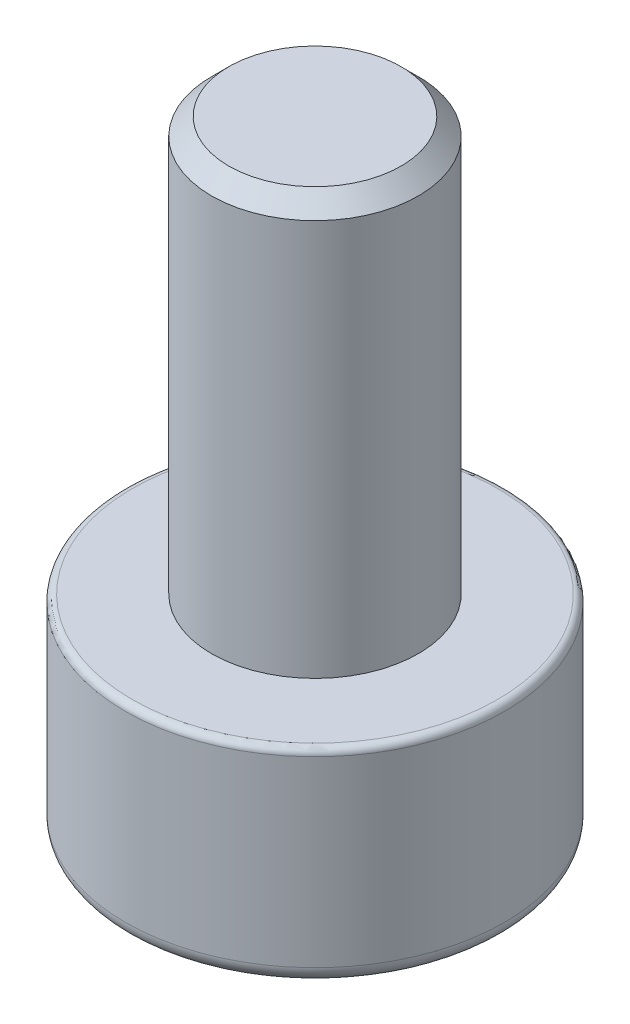
ISO-10303-21;
HEADER;
FILE_DESCRIPTION(('STEP AP214'),'2;1');
FILE_NAME('part.step','',(''),(''),'','','');
FILE_SCHEMA(('AUTOMOTIVE_DESIGN { 1 0 10303 214 1 1 1 1 }'));
ENDSEC;
DATA;
#1=APPLICATION_CONTEXT('core data for automotive mechanical design processes');
#2=APPLICATION_PROTOCOL_DEFINITION('international standard','automotive_design',2000,#1);
#3=PRODUCT_CONTEXT('',#1,'mechanical');
#4=PRODUCT('Part','Part','',(#3));
#5=PRODUCT_RELATED_PRODUCT_CATEGORY('part','',(#4));
#6=PRODUCT_DEFINITION_FORMATION('','',#4);
#7=PRODUCT_DEFINITION_CONTEXT('part definition',#1,'design');
#8=PRODUCT_DEFINITION('design','',#6,#7);
#9=PRODUCT_DEFINITION_SHAPE('','',#8);
#10=(LENGTH_UNIT() NAMED_UNIT(*) SI_UNIT(.MILLI.,.METRE.));
#11=(NAMED_UNIT(*) PLANE_ANGLE_UNIT() SI_UNIT($,.RADIAN.));
#12=(NAMED_UNIT(*) SI_UNIT($,.STERADIAN.) SOLID_ANGLE_UNIT());
#13=UNCERTAINTY_MEASURE_WITH_UNIT(LENGTH_MEASURE(1.E-05),#10,'distance_accuracy_value','');
#14=(GEOMETRIC_REPRESENTATION_CONTEXT(3) GLOBAL_UNCERTAINTY_ASSIGNED_CONTEXT((#13)) GLOBAL_UNIT_ASSIGNED_CONTEXT((#10,
#11,#12)) REPRESENTATION_CONTEXT('',''));
#15=CARTESIAN_POINT('',(0.,0.,0.));
#16=DIRECTION('',(0.,0.,1.));
#17=DIRECTION('',(1.,0.,0.));
#18=AXIS2_PLACEMENT_3D('',#15,#16,#17);
#19=CARTESIAN_POINT('',(0.,3.,0.));
#20=DIRECTION('',(0.,-1.,0.));
#21=DIRECTION('',(0.,0.,-1.));
#22=AXIS2_PLACEMENT_3D('',#19,#20,#21);
#23=CYLINDRICAL_SURFACE('',#22,2.75);
#24=CARTESIAN_POINT('',(0.,2.9,0.));
#25=DIRECTION('',(0.,1.,0.));
#26=DIRECTION('',(0.,0.,1.));
#27=AXIS2_PLACEMENT_3D('',#24,#25,#26);
#28=CIRCLE('',#27,2.75);
#29=CARTESIAN_POINT('',(0.,2.9,2.75));
#30=VERTEX_POINT('',#29);
#31=EDGE_CURVE('E11',#30,#30,#28,.F.);
#32=ORIENTED_EDGE('',*,*,#31,.T.);
#33=EDGE_LOOP('',(#32));
#34=FACE_BOUND('',#33,.T.);
#35=CARTESIAN_POINT('',(0.,0.25,0.));
#36=DIRECTION('',(0.,1.,0.));
#37=DIRECTION('',(0.,0.,1.));
#38=AXIS2_PLACEMENT_3D('',#35,#36,#37);
#39=CIRCLE('',#38,2.75);
#40=CARTESIAN_POINT('',(0.,0.25,2.75));
#41=VERTEX_POINT('',#40);
#42=EDGE_CURVE('E176',#41,#41,#39,.T.);
#43=ORIENTED_EDGE('',*,*,#42,.T.);
#44=EDGE_LOOP('',(#43));
#45=FACE_BOUND('',#44,.T.);
#46=ADVANCED_FACE('F32',(#34,#45),#23,.T.);
#47=CARTESIAN_POINT('',(0.,3.,0.));
#48=DIRECTION('',(0.,1.,0.));
#49=DIRECTION('',(0.,0.,1.));
#50=AXIS2_PLACEMENT_3D('',#47,#48,#49);
#51=PLANE('',#50);
#52=CARTESIAN_POINT('',(0.,3.,0.));
#53=DIRECTION('',(0.,1.,0.));
#54=DIRECTION('',(0.,0.,1.));
#55=AXIS2_PLACEMENT_3D('',#52,#53,#54);
#56=CIRCLE('',#55,2.65);
#57=CARTESIAN_POINT('',(0.,3.,2.65));
#58=VERTEX_POINT('',#57);
#59=EDGE_CURVE('E40',#58,#58,#56,.T.);
#60=ORIENTED_EDGE('',*,*,#59,.T.);
#61=EDGE_LOOP('',(#60));
#62=FACE_BOUND('',#61,.T.);
#63=CARTESIAN_POINT('',(0.,3.,0.));
#64=DIRECTION('',(0.,1.,0.));
#65=DIRECTION('',(0.,0.,1.));
#66=AXIS2_PLACEMENT_3D('',#63,#64,#65);
#67=CIRCLE('',#66,1.5);
#68=CARTESIAN_POINT('',(0.,3.,1.5));
#69=VERTEX_POINT('',#68);
#70=EDGE_CURVE('E140',#69,#69,#67,.T.);
#71=ORIENTED_EDGE('',*,*,#70,.F.);
#72=EDGE_LOOP('',(#71));
#73=FACE_BOUND('',#72,.T.);
#74=ADVANCED_FACE('F202',(#62,#73),#51,.T.);
#75=CARTESIAN_POINT('',(0.,0.,0.));
#76=DIRECTION('',(0.,1.,0.));
#77=DIRECTION('',(0.,0.,1.));
#78=AXIS2_PLACEMENT_3D('',#75,#76,#77);
#79=PLANE('',#78);
#80=CARTESIAN_POINT('',(0.,0.,0.));
#81=DIRECTION('',(0.,1.,0.));
#82=DIRECTION('',(0.,0.,1.));
#83=AXIS2_PLACEMENT_3D('',#80,#81,#82);
#84=CIRCLE('',#83,2.5);
#85=CARTESIAN_POINT('',(0.,0.,2.5));
#86=VERTEX_POINT('',#85);
#87=EDGE_CURVE('E191',#86,#86,#84,.F.);
#88=ORIENTED_EDGE('',*,*,#87,.T.);
#89=EDGE_LOOP('',(#88));
#90=FACE_BOUND('',#89,.T.);
#91=DIRECTION('',(-0.69197693122312,0.,-0.721919612321922));
#92=VECTOR('',#91,1.);
#93=CARTESIAN_POINT('',(1.02450088015783,0.,-0.982008194523007));
#94=LINE('',#93,#92);
#95=CARTESIAN_POINT('',(1.59146357561211,0.,-0.390512335578876));
#96=VERTEX_POINT('',#95);
#97=CARTESIAN_POINT('',(0.457538184703553,0.,-1.57350405346714));
#98=VERTEX_POINT('',#97);
#99=EDGE_CURVE('E155',#96,#98,#94,.T.);
#100=ORIENTED_EDGE('',*,*,#99,.T.);
#101=DIRECTION('',(-0.971189189372558,0.,0.238309795111058));
#102=VECTOR('',#101,1.);
#103=CARTESIAN_POINT('',(-0.3381936031025,0.,-1.3782478856777));
#104=LINE('',#103,#102);
#105=CARTESIAN_POINT('',(-1.13392539090855,0.,-1.18299171788826));
#106=VERTEX_POINT('',#105);
#107=EDGE_CURVE('E165',#98,#106,#104,.T.);
#108=ORIENTED_EDGE('',*,*,#107,.T.);
#109=DIRECTION('',(-0.279212258149438,0.,0.96022940743298));
#110=VECTOR('',#109,1.);
#111=CARTESIAN_POINT('',(-1.36269448326033,0.,-0.396239691154693));
#112=LINE('',#111,#110);
#113=CARTESIAN_POINT('',(-1.5914635756121,0.,0.390512335578876));
#114=VERTEX_POINT('',#113);
#115=EDGE_CURVE('E163',#106,#114,#112,.T.);
#116=ORIENTED_EDGE('',*,*,#115,.T.);
#117=DIRECTION('',(0.69197693122312,0.,0.721919612321922));
#118=VECTOR('',#117,1.);
#119=CARTESIAN_POINT('',(-1.02450088015783,0.,0.982008194523007));
#120=LINE('',#119,#118);
#121=CARTESIAN_POINT('',(-0.457538184703552,0.,1.57350405346714));
#122=VERTEX_POINT('',#121);
#123=EDGE_CURVE('E161',#114,#122,#120,.T.);
#124=ORIENTED_EDGE('',*,*,#123,.T.);
#125=DIRECTION('',(0.971189189372558,0.,-0.238309795111058));
#126=VECTOR('',#125,1.);
#127=CARTESIAN_POINT('',(0.3381936031025,0.,1.3782478856777));
#128=LINE('',#127,#126);
#129=CARTESIAN_POINT('',(1.13392539090855,0.,1.18299171788826));
#130=VERTEX_POINT('',#129);
#131=EDGE_CURVE('E159',#122,#130,#128,.T.);
#132=ORIENTED_EDGE('',*,*,#131,.T.);
#133=DIRECTION('',(0.279212258149438,0.,-0.96022940743298));
#134=VECTOR('',#133,1.);
#135=CARTESIAN_POINT('',(1.36269448326033,0.,0.396239691154693));
#136=LINE('',#135,#134);
#137=EDGE_CURVE('E157',#130,#96,#136,.T.);
#138=ORIENTED_EDGE('',*,*,#137,.T.);
#139=EDGE_LOOP('',(#100,#108,#116,#124,#132,#138));
#140=FACE_BOUND('',#139,.T.);
#141=ADVANCED_FACE('F220',(#90,#140),#79,.F.);
#142=CARTESIAN_POINT('',(0.,9.,0.));
#143=DIRECTION('',(0.,-1.,0.));
#144=DIRECTION('',(0.,0.,-1.));
#145=AXIS2_PLACEMENT_3D('',#142,#143,#144);
#146=CYLINDRICAL_SURFACE('',#145,1.5);
#147=CARTESIAN_POINT('',(0.,8.75,0.));
#148=DIRECTION('',(0.,1.,0.));
#149=DIRECTION('',(0.,0.,1.));
#150=AXIS2_PLACEMENT_3D('',#147,#148,#149);
#151=CIRCLE('',#150,1.5);
#152=CARTESIAN_POINT('',(0.,8.75,1.5));
#153=VERTEX_POINT('',#152);
#154=EDGE_CURVE('E197',#153,#153,#151,.F.);
#155=ORIENTED_EDGE('',*,*,#154,.T.);
#156=EDGE_LOOP('',(#155));
#157=FACE_BOUND('',#156,.T.);
#158=ORIENTED_EDGE('',*,*,#70,.T.);
#159=EDGE_LOOP('',(#158));
#160=FACE_BOUND('',#159,.T.);
#161=ADVANCED_FACE('F259',(#157,#160),#146,.T.);
#162=CARTESIAN_POINT('',(0.,9.,0.));
#163=DIRECTION('',(0.,1.,0.));
#164=DIRECTION('',(0.,0.,1.));
#165=AXIS2_PLACEMENT_3D('',#162,#163,#164);
#166=PLANE('',#165);
#167=CARTESIAN_POINT('',(0.,9.,0.));
#168=DIRECTION('',(0.,1.,0.));
#169=DIRECTION('',(0.,0.,1.));
#170=AXIS2_PLACEMENT_3D('',#167,#168,#169);
#171=CIRCLE('',#170,1.25);
#172=CARTESIAN_POINT('',(0.,9.,1.25));
#173=VERTEX_POINT('',#172);
#174=EDGE_CURVE('E194',#173,#173,#171,.T.);
#175=ORIENTED_EDGE('',*,*,#174,.T.);
#176=EDGE_LOOP('',(#175));
#177=FACE_BOUND('',#176,.T.);
#178=ADVANCED_FACE('F298',(#177),#166,.T.);
#179=CARTESIAN_POINT('',(1.31110540565295,1.5,-0.321718223399928));
#180=DIRECTION('',(0.96022940743298,0.,0.279212258149438));
#181=DIRECTION('',(0.279212258149438,0.,-0.96022940743298));
#182=AXIS2_PLACEMENT_3D('',#179,#180,#181);
#183=PLANE('',#182);
#184=DIRECTION('',(0.,-1.,0.));
#185=VECTOR('',#184,1.);
#186=CARTESIAN_POINT('',(1.31110540565295,1.5,-0.321718223399928));
#187=LINE('',#186,#185);
#188=CARTESIAN_POINT('',(1.31110540565295,1.5,-0.321718223399928));
#189=VERTEX_POINT('',#188);
#190=CARTESIAN_POINT('',(1.31110540565295,0.250000000000002,-0.321718223399928));
#191=VERTEX_POINT('',#190);
#192=EDGE_CURVE('E138',#189,#191,#187,.T.);
#193=ORIENTED_EDGE('',*,*,#192,.T.);
#194=DIRECTION('',(-0.279212258149438,0.,0.96022940743298));
#195=VECTOR('',#194,1.);
#196=CARTESIAN_POINT('',(1.31110540565295,0.250000000000002,-0.321718223399928));
#197=LINE('',#196,#195);
#198=CARTESIAN_POINT('',(0.934168857151212,0.250000000000002,0.974591476634595));
#199=VERTEX_POINT('',#198);
#200=EDGE_CURVE('E54',#191,#199,#197,.T.);
#201=ORIENTED_EDGE('',*,*,#200,.T.);
#202=DIRECTION('',(0.,-1.,0.));
#203=VECTOR('',#202,1.);
#204=CARTESIAN_POINT('',(0.934168857151212,1.5,0.974591476634595));
#205=LINE('',#204,#203);
#206=CARTESIAN_POINT('',(0.934168857151212,1.5,0.974591476634595));
#207=VERTEX_POINT('',#206);
#208=EDGE_CURVE('E102',#207,#199,#205,.T.);
#209=ORIENTED_EDGE('',*,*,#208,.F.);
#210=DIRECTION('',(-0.279212258149438,0.,0.96022940743298));
#211=VECTOR('',#210,1.);
#212=CARTESIAN_POINT('',(1.31110540565295,1.5,-0.321718223399928));
#213=LINE('',#212,#211);
#214=EDGE_CURVE('E106',#189,#207,#213,.T.);
#215=ORIENTED_EDGE('',*,*,#214,.F.);
#216=EDGE_LOOP('',(#193,#201,#209,#215));
#217=FACE_BOUND('',#216,.T.);
#218=ADVANCED_FACE('F104',(#217),#183,.F.);
#219=CARTESIAN_POINT('',(0.376936548501741,1.5,-1.29630970003452));
#220=DIRECTION('',(0.721919612321922,0.,-0.69197693122312));
#221=DIRECTION('',(-0.69197693122312,0.,-0.721919612321922));
#222=AXIS2_PLACEMENT_3D('',#219,#220,#221);
#223=PLANE('',#222);
#224=DIRECTION('',(0.,-1.,0.));
#225=VECTOR('',#224,1.);
#226=CARTESIAN_POINT('',(0.376936548501741,1.5,-1.29630970003452));
#227=LINE('',#226,#225);
#228=CARTESIAN_POINT('',(0.376936548501741,1.5,-1.29630970003452));
#229=VERTEX_POINT('',#228);
#230=CARTESIAN_POINT('',(0.376936548501741,0.250000000000002,-1.29630970003452));
#231=VERTEX_POINT('',#230);
#232=EDGE_CURVE('E141',#229,#231,#227,.T.);
#233=ORIENTED_EDGE('',*,*,#232,.T.);
#234=DIRECTION('',(0.69197693122312,0.,0.721919612321922));
#235=VECTOR('',#234,1.);
#236=CARTESIAN_POINT('',(0.376936548501741,0.250000000000002,-1.29630970003452));
#237=LINE('',#236,#235);
#238=EDGE_CURVE('E47',#231,#191,#237,.T.);
#239=ORIENTED_EDGE('',*,*,#238,.T.);
#240=ORIENTED_EDGE('',*,*,#192,.F.);
#241=DIRECTION('',(0.69197693122312,0.,0.721919612321922));
#242=VECTOR('',#241,1.);
#243=CARTESIAN_POINT('',(0.376936548501741,1.5,-1.29630970003452));
#244=LINE('',#243,#242);
#245=EDGE_CURVE('E111',#229,#189,#244,.T.);
#246=ORIENTED_EDGE('',*,*,#245,.F.);
#247=EDGE_LOOP('',(#233,#239,#240,#246));
#248=FACE_BOUND('',#247,.T.);
#249=ADVANCED_FACE('F271',(#248),#223,.F.);
#250=CARTESIAN_POINT('',(-0.934168857151211,1.5,-0.974591476634595));
#251=DIRECTION('',(-0.238309795111058,0.,-0.971189189372557));
#252=DIRECTION('',(-0.971189189372558,0.,0.238309795111058));
#253=AXIS2_PLACEMENT_3D('',#250,#251,#252);
#254=PLANE('',#253);
#255=DIRECTION('',(0.,-1.,0.));
#256=VECTOR('',#255,1.);
#257=CARTESIAN_POINT('',(-0.934168857151211,1.5,-0.974591476634595));
#258=LINE('',#257,#256);
#259=CARTESIAN_POINT('',(-0.934168857151211,1.5,-0.974591476634595));
#260=VERTEX_POINT('',#259);
#261=CARTESIAN_POINT('',(-0.934168857151211,0.250000000000002,-0.974591476634595));
#262=VERTEX_POINT('',#261);
#263=EDGE_CURVE('E143',#260,#262,#258,.T.);
#264=ORIENTED_EDGE('',*,*,#263,.T.);
#265=DIRECTION('',(0.971189189372558,0.,-0.238309795111058));
#266=VECTOR('',#265,1.);
#267=CARTESIAN_POINT('',(-0.934168857151211,0.250000000000002,-0.974591476634595));
#268=LINE('',#267,#266);
#269=EDGE_CURVE('E152',#262,#231,#268,.T.);
#270=ORIENTED_EDGE('',*,*,#269,.T.);
#271=ORIENTED_EDGE('',*,*,#232,.F.);
#272=DIRECTION('',(0.971189189372558,0.,-0.238309795111058));
#273=VECTOR('',#272,1.);
#274=CARTESIAN_POINT('',(-0.934168857151211,1.5,-0.974591476634595));
#275=LINE('',#274,#273);
#276=EDGE_CURVE('E135',#260,#229,#275,.T.);
#277=ORIENTED_EDGE('',*,*,#276,.F.);
#278=EDGE_LOOP('',(#264,#270,#271,#277));
#279=FACE_BOUND('',#278,.T.);
#280=ADVANCED_FACE('F269',(#279),#254,.F.);
#281=CARTESIAN_POINT('',(-1.31110540565295,1.5,0.321718223399928));
#282=DIRECTION('',(-0.96022940743298,0.,-0.279212258149438));
#283=DIRECTION('',(-0.279212258149438,0.,0.96022940743298));
#284=AXIS2_PLACEMENT_3D('',#281,#282,#283);
#285=PLANE('',#284);
#286=DIRECTION('',(0.,-1.,0.));
#287=VECTOR('',#286,1.);
#288=CARTESIAN_POINT('',(-1.31110540565295,1.5,0.321718223399928));
#289=LINE('',#288,#287);
#290=CARTESIAN_POINT('',(-1.31110540565295,1.5,0.321718223399928));
#291=VERTEX_POINT('',#290);
#292=CARTESIAN_POINT('',(-1.31110540565295,0.250000000000002,0.321718223399928));
#293=VERTEX_POINT('',#292);
#294=EDGE_CURVE('E146',#291,#293,#289,.T.);
#295=ORIENTED_EDGE('',*,*,#294,.T.);
#296=DIRECTION('',(0.279212258149438,0.,-0.96022940743298));
#297=VECTOR('',#296,1.);
#298=CARTESIAN_POINT('',(-1.31110540565295,0.250000000000002,0.321718223399928));
#299=LINE('',#298,#297);
#300=EDGE_CURVE('E168',#293,#262,#299,.T.);
#301=ORIENTED_EDGE('',*,*,#300,.T.);
#302=ORIENTED_EDGE('',*,*,#263,.F.);
#303=DIRECTION('',(0.279212258149438,0.,-0.96022940743298));
#304=VECTOR('',#303,1.);
#305=CARTESIAN_POINT('',(-1.31110540565295,1.5,0.321718223399928));
#306=LINE('',#305,#304);
#307=EDGE_CURVE('E132',#291,#260,#306,.T.);
#308=ORIENTED_EDGE('',*,*,#307,.F.);
#309=EDGE_LOOP('',(#295,#301,#302,#308));
#310=FACE_BOUND('',#309,.T.);
#311=ADVANCED_FACE('F280',(#310),#285,.F.);
#312=CARTESIAN_POINT('',(-0.376936548501741,1.5,1.29630970003452));
#313=DIRECTION('',(-0.721919612321922,0.,0.69197693122312));
#314=DIRECTION('',(0.69197693122312,0.,0.721919612321922));
#315=AXIS2_PLACEMENT_3D('',#312,#313,#314);
#316=PLANE('',#315);
#317=DIRECTION('',(0.,-1.,0.));
#318=VECTOR('',#317,1.);
#319=CARTESIAN_POINT('',(-0.376936548501741,1.5,1.29630970003452));
#320=LINE('',#319,#318);
#321=CARTESIAN_POINT('',(-0.376936548501741,1.5,1.29630970003452));
#322=VERTEX_POINT('',#321);
#323=CARTESIAN_POINT('',(-0.376936548501741,0.250000000000002,1.29630970003452));
#324=VERTEX_POINT('',#323);
#325=EDGE_CURVE('E110',#322,#324,#320,.T.);
#326=ORIENTED_EDGE('',*,*,#325,.T.);
#327=DIRECTION('',(-0.69197693122312,0.,-0.721919612321922));
#328=VECTOR('',#327,1.);
#329=CARTESIAN_POINT('',(-0.376936548501741,0.250000000000002,1.29630970003452));
#330=LINE('',#329,#328);
#331=EDGE_CURVE('E170',#324,#293,#330,.T.);
#332=ORIENTED_EDGE('',*,*,#331,.T.);
#333=ORIENTED_EDGE('',*,*,#294,.F.);
#334=DIRECTION('',(-0.69197693122312,0.,-0.721919612321922));
#335=VECTOR('',#334,1.);
#336=CARTESIAN_POINT('',(-0.376936548501741,1.5,1.29630970003452));
#337=LINE('',#336,#335);
#338=EDGE_CURVE('E120',#322,#291,#337,.T.);
#339=ORIENTED_EDGE('',*,*,#338,.F.);
#340=EDGE_LOOP('',(#326,#332,#333,#339));
#341=FACE_BOUND('',#340,.T.);
#342=ADVANCED_FACE('F277',(#341),#316,.F.);
#343=CARTESIAN_POINT('',(0.934168857151212,1.5,0.974591476634595));
#344=DIRECTION('',(0.238309795111058,0.,0.971189189372558));
#345=DIRECTION('',(0.971189189372558,0.,-0.238309795111058));
#346=AXIS2_PLACEMENT_3D('',#343,#344,#345);
#347=PLANE('',#346);
#348=ORIENTED_EDGE('',*,*,#208,.T.);
#349=DIRECTION('',(-0.971189189372558,0.,0.238309795111058));
#350=VECTOR('',#349,1.);
#351=CARTESIAN_POINT('',(0.934168857151212,0.250000000000002,0.974591476634595));
#352=LINE('',#351,#350);
#353=EDGE_CURVE('E172',#199,#324,#352,.T.);
#354=ORIENTED_EDGE('',*,*,#353,.T.);
#355=ORIENTED_EDGE('',*,*,#325,.F.);
#356=DIRECTION('',(-0.971189189372557,0.,0.238309795111058));
#357=VECTOR('',#356,1.);
#358=CARTESIAN_POINT('',(0.934168857151212,1.5,0.974591476634595));
#359=LINE('',#358,#357);
#360=EDGE_CURVE('E114',#207,#322,#359,.T.);
#361=ORIENTED_EDGE('',*,*,#360,.F.);
#362=EDGE_LOOP('',(#348,#354,#355,#361));
#363=FACE_BOUND('',#362,.T.);
#364=ADVANCED_FACE('F115',(#363),#347,.F.);
#365=CARTESIAN_POINT('',(0.,1.5,0.));
#366=DIRECTION('',(0.,-1.,0.));
#367=DIRECTION('',(0.,0.,-1.));
#368=AXIS2_PLACEMENT_3D('',#365,#366,#367);
#369=PLANE('',#368);
#370=ORIENTED_EDGE('',*,*,#214,.T.);
#371=ORIENTED_EDGE('',*,*,#360,.T.);
#372=ORIENTED_EDGE('',*,*,#338,.T.);
#373=ORIENTED_EDGE('',*,*,#307,.T.);
#374=ORIENTED_EDGE('',*,*,#276,.T.);
#375=ORIENTED_EDGE('',*,*,#245,.T.);
#376=EDGE_LOOP('',(#370,#371,#372,#373,#374,#375));
#377=FACE_BOUND('',#376,.T.);
#378=ADVANCED_FACE('F122',(#377),#369,.T.);
#379=CARTESIAN_POINT('',(0.934168857151212,0.250000000000002,0.974591476634595));
#380=DIRECTION('',(0.168510472146206,0.707106781186547,0.686734461620402));
#381=DIRECTION('',(-0.971189189372558,0.,0.238309795111058));
#382=AXIS2_PLACEMENT_3D('',#379,#380,#381);
#383=PLANE('',#382);
#384=DIRECTION('',(-0.523085392288577,0.654653670707978,-0.545719931652561));
#385=VECTOR('',#384,1.);
#386=CARTESIAN_POINT('',(0.934168857151212,0.250000000000002,0.974591476634595));
#387=LINE('',#386,#385);
#388=EDGE_CURVE('E128',#130,#199,#387,.T.);
#389=ORIENTED_EDGE('',*,*,#388,.F.);
#390=ORIENTED_EDGE('',*,*,#131,.F.);
#391=DIRECTION('',(0.211064628018337,0.654653670707978,-0.725865203896737));
#392=VECTOR('',#391,1.);
#393=CARTESIAN_POINT('',(-0.376936548501741,0.250000000000002,1.29630970003452));
#394=LINE('',#393,#392);
#395=EDGE_CURVE('E125',#324,#122,#394,.F.);
#396=ORIENTED_EDGE('',*,*,#395,.F.);
#397=ORIENTED_EDGE('',*,*,#353,.F.);
#398=EDGE_LOOP('',(#389,#390,#396,#397));
#399=FACE_BOUND('',#398,.T.);
#400=ADVANCED_FACE('F244',(#399),#383,.F.);
#401=CARTESIAN_POINT('',(-0.376936548501741,0.250000000000002,1.29630970003452));
#402=DIRECTION('',(-0.510474253344395,0.707106781186547,0.489301580492525));
#403=DIRECTION('',(-0.69197693122312,0.,-0.721919612321922));
#404=AXIS2_PLACEMENT_3D('',#401,#402,#403);
#405=PLANE('',#404);
#406=ORIENTED_EDGE('',*,*,#395,.T.);
#407=ORIENTED_EDGE('',*,*,#123,.F.);
#408=DIRECTION('',(0.734150020306914,0.654653670707978,-0.180145272244176));
#409=VECTOR('',#408,1.);
#410=CARTESIAN_POINT('',(-1.31110540565295,0.250000000000002,0.321718223399928));
#411=LINE('',#410,#409);
#412=EDGE_CURVE('E184',#293,#114,#411,.F.);
#413=ORIENTED_EDGE('',*,*,#412,.F.);
#414=ORIENTED_EDGE('',*,*,#331,.F.);
#415=EDGE_LOOP('',(#406,#407,#413,#414));
#416=FACE_BOUND('',#415,.T.);
#417=ADVANCED_FACE('F240',(#416),#405,.F.);
#418=CARTESIAN_POINT('',(1.31110540565295,0.250000000000002,-0.321718223399928));
#419=DIRECTION('',(0.678984725490601,0.707106781186547,0.197432881127877));
#420=DIRECTION('',(-0.279212258149438,0.,0.96022940743298));
#421=AXIS2_PLACEMENT_3D('',#418,#419,#420);
#422=PLANE('',#421);
#423=ORIENTED_EDGE('',*,*,#388,.T.);
#424=ORIENTED_EDGE('',*,*,#200,.F.);
#425=DIRECTION('',(-0.734150020306914,0.654653670707978,0.180145272244176));
#426=VECTOR('',#425,1.);
#427=CARTESIAN_POINT('',(1.31110540565295,0.250000000000002,-0.321718223399928));
#428=LINE('',#427,#426);
#429=EDGE_CURVE('E181',#96,#191,#428,.T.);
#430=ORIENTED_EDGE('',*,*,#429,.F.);
#431=ORIENTED_EDGE('',*,*,#137,.F.);
#432=EDGE_LOOP('',(#423,#424,#430,#431));
#433=FACE_BOUND('',#432,.T.);
#434=ADVANCED_FACE('F236',(#433),#422,.F.);
#435=CARTESIAN_POINT('',(-1.31110540565295,0.250000000000002,0.321718223399928));
#436=DIRECTION('',(-0.678984725490601,0.707106781186547,-0.197432881127877));
#437=DIRECTION('',(0.279212258149438,0.,-0.96022940743298));
#438=AXIS2_PLACEMENT_3D('',#435,#436,#437);
#439=PLANE('',#438);
#440=ORIENTED_EDGE('',*,*,#412,.T.);
#441=ORIENTED_EDGE('',*,*,#115,.F.);
#442=DIRECTION('',(0.523085392288577,0.654653670707978,0.545719931652561));
#443=VECTOR('',#442,1.);
#444=CARTESIAN_POINT('',(-0.934168857151211,0.250000000000002,-0.974591476634595));
#445=LINE('',#444,#443);
#446=EDGE_CURVE('E179',#262,#106,#445,.F.);
#447=ORIENTED_EDGE('',*,*,#446,.F.);
#448=ORIENTED_EDGE('',*,*,#300,.F.);
#449=EDGE_LOOP('',(#440,#441,#447,#448));
#450=FACE_BOUND('',#449,.T.);
#451=ADVANCED_FACE('F232',(#450),#439,.F.);
#452=CARTESIAN_POINT('',(0.376936548501741,0.250000000000002,-1.29630970003452));
#453=DIRECTION('',(0.510474253344395,0.707106781186547,-0.489301580492525));
#454=DIRECTION('',(0.69197693122312,0.,0.721919612321922));
#455=AXIS2_PLACEMENT_3D('',#452,#453,#454);
#456=PLANE('',#455);
#457=ORIENTED_EDGE('',*,*,#429,.T.);
#458=ORIENTED_EDGE('',*,*,#238,.F.);
#459=DIRECTION('',(0.211064628018338,-0.654653670707978,-0.725865203896737));
#460=VECTOR('',#459,1.);
#461=CARTESIAN_POINT('',(0.269240391786958,0.584038370031143,-0.92593550002466));
#462=LINE('',#461,#460);
#463=EDGE_CURVE('E177',#98,#231,#462,.F.);
#464=ORIENTED_EDGE('',*,*,#463,.F.);
#465=ORIENTED_EDGE('',*,*,#99,.F.);
#466=EDGE_LOOP('',(#457,#458,#464,#465));
#467=FACE_BOUND('',#466,.T.);
#468=ADVANCED_FACE('F228',(#467),#456,.F.);
#469=CARTESIAN_POINT('',(-0.934168857151211,0.250000000000002,-0.974591476634595));
#470=DIRECTION('',(-0.168510472146206,0.707106781186547,-0.686734461620402));
#471=DIRECTION('',(0.971189189372558,0.,-0.238309795111058));
#472=AXIS2_PLACEMENT_3D('',#469,#470,#471);
#473=PLANE('',#472);
#474=ORIENTED_EDGE('',*,*,#446,.T.);
#475=ORIENTED_EDGE('',*,*,#107,.F.);
#476=ORIENTED_EDGE('',*,*,#463,.T.);
#477=ORIENTED_EDGE('',*,*,#269,.F.);
#478=EDGE_LOOP('',(#474,#475,#476,#477));
#479=FACE_BOUND('',#478,.T.);
#480=ADVANCED_FACE('F225',(#479),#473,.F.);
#481=CARTESIAN_POINT('',(0.,0.25,0.));
#482=DIRECTION('',(0.,1.,0.));
#483=DIRECTION('',(0.,0.,1.));
#484=AXIS2_PLACEMENT_3D('',#481,#482,#483);
#485=TOROIDAL_SURFACE('',#484,2.5,0.25);
#486=ORIENTED_EDGE('',*,*,#87,.F.);
#487=EDGE_LOOP('',(#486));
#488=FACE_BOUND('',#487,.T.);
#489=ORIENTED_EDGE('',*,*,#42,.F.);
#490=EDGE_LOOP('',(#489));
#491=FACE_BOUND('',#490,.T.);
#492=ADVANCED_FACE('F211',(#488,#491),#485,.T.);
#493=CARTESIAN_POINT('',(0.,9.,0.));
#494=DIRECTION('',(0.,-1.,0.));
#495=DIRECTION('',(0.,0.,-1.));
#496=AXIS2_PLACEMENT_3D('',#493,#494,#495);
#497=CONICAL_SURFACE('',#496,1.25,0.785398163397443);
#498=ORIENTED_EDGE('',*,*,#154,.F.);
#499=EDGE_LOOP('',(#498));
#500=FACE_BOUND('',#499,.T.);
#501=ORIENTED_EDGE('',*,*,#174,.F.);
#502=EDGE_LOOP('',(#501));
#503=FACE_BOUND('',#502,.T.);
#504=ADVANCED_FACE('F206',(#500,#503),#497,.T.);
#505=CARTESIAN_POINT('',(0.,2.9,0.));
#506=DIRECTION('',(0.,1.,0.));
#507=DIRECTION('',(0.,0.,1.));
#508=AXIS2_PLACEMENT_3D('',#505,#506,#507);
#509=TOROIDAL_SURFACE('',#508,2.65,0.1);
#510=ORIENTED_EDGE('',*,*,#31,.F.);
#511=EDGE_LOOP('',(#510));
#512=FACE_BOUND('',#511,.T.);
#513=ORIENTED_EDGE('',*,*,#59,.F.);
#514=EDGE_LOOP('',(#513));
#515=FACE_BOUND('',#514,.T.);
#516=ADVANCED_FACE('F34',(#512,#515),#509,.T.);
#517=CLOSED_SHELL('',(#46,#74,#141,#161,#178,#218,#249,#280,#311,#342,#364,#378,#400,#417,#434,
#451,#468,#480,#492,#504,#516));
#518=MANIFOLD_SOLID_BREP('B2',#517);
#519=ADVANCED_BREP_SHAPE_REPRESENTATION('',(#18,#518),#14);
#520=SHAPE_DEFINITION_REPRESENTATION(#9,#519);
ENDSEC;
END-ISO-10303-21;
